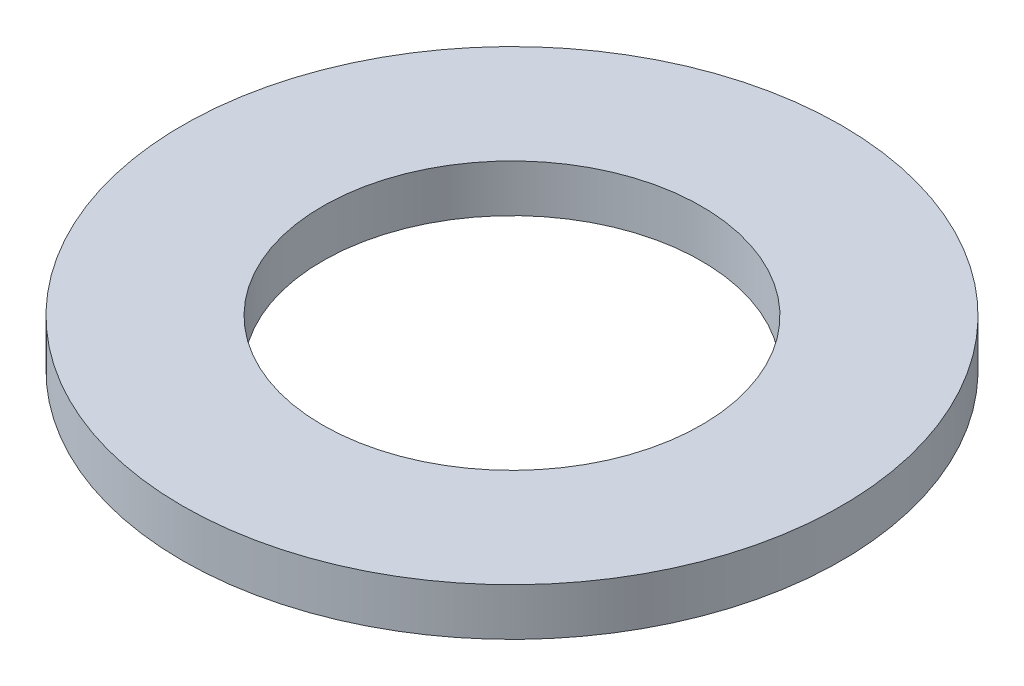
ISO-10303-21;
HEADER;
FILE_DESCRIPTION(('STEP AP214'),'2;1');
FILE_NAME('part.step','',(''),(''),'','','');
FILE_SCHEMA(('AUTOMOTIVE_DESIGN { 1 0 10303 214 1 1 1 1 }'));
ENDSEC;
DATA;
#1=APPLICATION_CONTEXT('core data for automotive mechanical design processes');
#2=APPLICATION_PROTOCOL_DEFINITION('international standard','automotive_design',2000,#1);
#3=PRODUCT_CONTEXT('',#1,'mechanical');
#4=PRODUCT('Part','Part','',(#3));
#5=PRODUCT_RELATED_PRODUCT_CATEGORY('part','',(#4));
#6=PRODUCT_DEFINITION_FORMATION('','',#4);
#7=PRODUCT_DEFINITION_CONTEXT('part definition',#1,'design');
#8=PRODUCT_DEFINITION('design','',#6,#7);
#9=PRODUCT_DEFINITION_SHAPE('','',#8);
#10=(LENGTH_UNIT() NAMED_UNIT(*) SI_UNIT(.MILLI.,.METRE.));
#11=(NAMED_UNIT(*) PLANE_ANGLE_UNIT() SI_UNIT($,.RADIAN.));
#12=(NAMED_UNIT(*) SI_UNIT($,.STERADIAN.) SOLID_ANGLE_UNIT());
#13=UNCERTAINTY_MEASURE_WITH_UNIT(LENGTH_MEASURE(1.E-05),#10,'distance_accuracy_value','');
#14=(GEOMETRIC_REPRESENTATION_CONTEXT(3) GLOBAL_UNCERTAINTY_ASSIGNED_CONTEXT((#13)) GLOBAL_UNIT_ASSIGNED_CONTEXT((#10,
#11,#12)) REPRESENTATION_CONTEXT('',''));
#15=CARTESIAN_POINT('',(0.,0.,0.));
#16=DIRECTION('',(0.,0.,1.));
#17=DIRECTION('',(1.,0.,0.));
#18=AXIS2_PLACEMENT_3D('',#15,#16,#17);
#19=CARTESIAN_POINT('',(0.,1.15,0.));
#20=DIRECTION('',(0.,1.,0.));
#21=DIRECTION('',(0.,0.,1.));
#22=AXIS2_PLACEMENT_3D('',#19,#20,#21);
#23=PLANE('',#22);
#24=CARTESIAN_POINT('',(0.,1.15,0.));
#25=DIRECTION('',(0.,1.,0.));
#26=DIRECTION('',(0.,0.,1.));
#27=AXIS2_PLACEMENT_3D('',#24,#25,#26);
#28=CIRCLE('',#27,8.);
#29=CARTESIAN_POINT('',(0.,1.15,8.));
#30=VERTEX_POINT('',#29);
#31=EDGE_CURVE('E10',#30,#30,#28,.T.);
#32=ORIENTED_EDGE('',*,*,#31,.T.);
#33=EDGE_LOOP('',(#32));
#34=FACE_BOUND('',#33,.T.);
#35=CARTESIAN_POINT('',(0.,1.15,0.));
#36=DIRECTION('',(0.,1.,0.));
#37=DIRECTION('',(0.,0.,1.));
#38=AXIS2_PLACEMENT_3D('',#35,#36,#37);
#39=CIRCLE('',#38,4.6);
#40=CARTESIAN_POINT('',(0.,1.15,4.6));
#41=VERTEX_POINT('',#40);
#42=EDGE_CURVE('E45',#41,#41,#39,.T.);
#43=ORIENTED_EDGE('',*,*,#42,.F.);
#44=EDGE_LOOP('',(#43));
#45=FACE_BOUND('',#44,.T.);
#46=ADVANCED_FACE('F34',(#34,#45),#23,.T.);
#47=CARTESIAN_POINT('',(0.,0.,0.));
#48=DIRECTION('',(0.,1.,0.));
#49=DIRECTION('',(0.,0.,1.));
#50=AXIS2_PLACEMENT_3D('',#47,#48,#49);
#51=PLANE('',#50);
#52=CARTESIAN_POINT('',(0.,0.,0.));
#53=DIRECTION('',(0.,1.,0.));
#54=DIRECTION('',(0.,0.,1.));
#55=AXIS2_PLACEMENT_3D('',#52,#53,#54);
#56=CIRCLE('',#55,8.);
#57=CARTESIAN_POINT('',(0.,0.,8.));
#58=VERTEX_POINT('',#57);
#59=EDGE_CURVE('E38',#58,#58,#56,.T.);
#60=ORIENTED_EDGE('',*,*,#59,.F.);
#61=EDGE_LOOP('',(#60));
#62=FACE_BOUND('',#61,.T.);
#63=CARTESIAN_POINT('',(0.,0.,0.));
#64=DIRECTION('',(0.,1.,0.));
#65=DIRECTION('',(0.,0.,1.));
#66=AXIS2_PLACEMENT_3D('',#63,#64,#65);
#67=CIRCLE('',#66,4.6);
#68=CARTESIAN_POINT('',(0.,0.,4.6));
#69=VERTEX_POINT('',#68);
#70=EDGE_CURVE('E47',#69,#69,#67,.T.);
#71=ORIENTED_EDGE('',*,*,#70,.T.);
#72=EDGE_LOOP('',(#71));
#73=FACE_BOUND('',#72,.T.);
#74=ADVANCED_FACE('F57',(#62,#73),#51,.F.);
#75=CARTESIAN_POINT('',(0.,1.15,0.));
#76=DIRECTION('',(0.,-1.,0.));
#77=DIRECTION('',(0.,0.,-1.));
#78=AXIS2_PLACEMENT_3D('',#75,#76,#77);
#79=CYLINDRICAL_SURFACE('',#78,8.);
#80=ORIENTED_EDGE('',*,*,#31,.F.);
#81=EDGE_LOOP('',(#80));
#82=FACE_BOUND('',#81,.T.);
#83=ORIENTED_EDGE('',*,*,#59,.T.);
#84=EDGE_LOOP('',(#83));
#85=FACE_BOUND('',#84,.T.);
#86=ADVANCED_FACE('F36',(#82,#85),#79,.T.);
#87=CARTESIAN_POINT('',(0.,1.15,0.));
#88=DIRECTION('',(0.,-1.,0.));
#89=DIRECTION('',(0.,0.,-1.));
#90=AXIS2_PLACEMENT_3D('',#87,#88,#89);
#91=CYLINDRICAL_SURFACE('',#90,4.6);
#92=ORIENTED_EDGE('',*,*,#42,.T.);
#93=EDGE_LOOP('',(#92));
#94=FACE_BOUND('',#93,.T.);
#95=ORIENTED_EDGE('',*,*,#70,.F.);
#96=EDGE_LOOP('',(#95));
#97=FACE_BOUND('',#96,.T.);
#98=ADVANCED_FACE('F53',(#94,#97),#91,.F.);
#99=CLOSED_SHELL('',(#46,#74,#86,#98));
#100=MANIFOLD_SOLID_BREP('B2',#99);
#101=ADVANCED_BREP_SHAPE_REPRESENTATION('',(#18,#100),#14);
#102=SHAPE_DEFINITION_REPRESENTATION(#9,#101);
ENDSEC;
END-ISO-10303-21;
